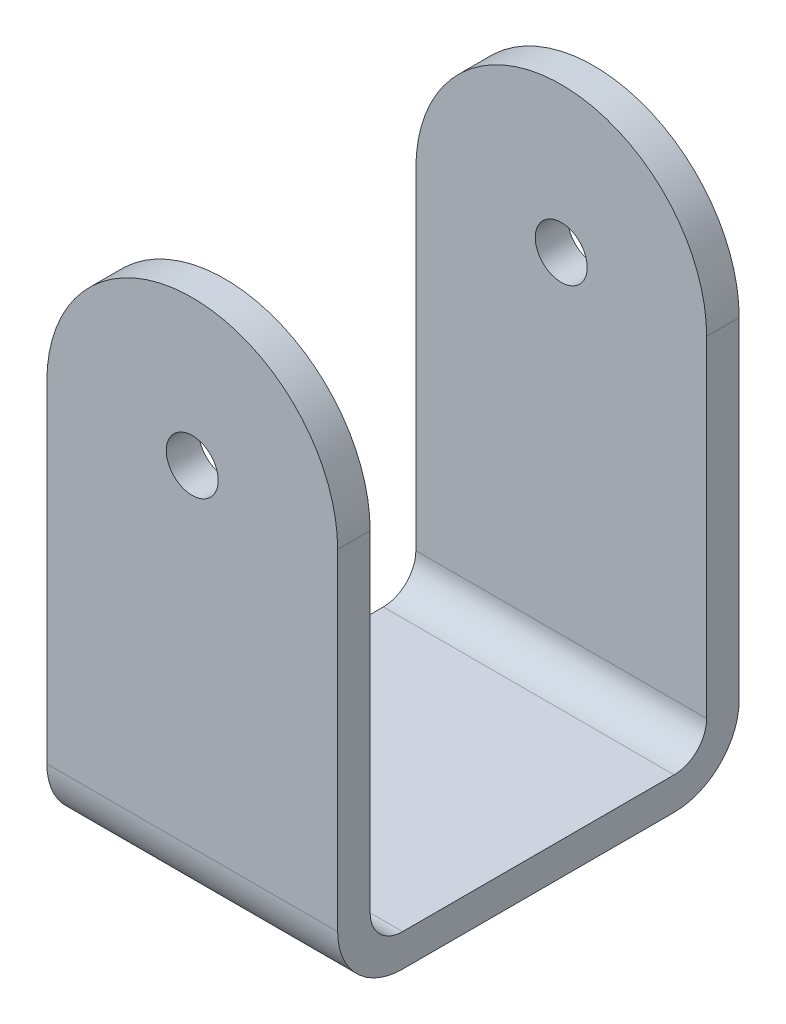
ISO-10303-21;
HEADER;
FILE_DESCRIPTION(('STEP AP214'),'2;1');
FILE_NAME('part.step','',(''),(''),'','','');
FILE_SCHEMA(('AUTOMOTIVE_DESIGN { 1 0 10303 214 1 1 1 1 }'));
ENDSEC;
DATA;
#1=APPLICATION_CONTEXT('core data for automotive mechanical design processes');
#2=APPLICATION_PROTOCOL_DEFINITION('international standard','automotive_design',2000,#1);
#3=PRODUCT_CONTEXT('',#1,'mechanical');
#4=PRODUCT('Part','Part','',(#3));
#5=PRODUCT_RELATED_PRODUCT_CATEGORY('part','',(#4));
#6=PRODUCT_DEFINITION_FORMATION('','',#4);
#7=PRODUCT_DEFINITION_CONTEXT('part definition',#1,'design');
#8=PRODUCT_DEFINITION('design','',#6,#7);
#9=PRODUCT_DEFINITION_SHAPE('','',#8);
#10=(LENGTH_UNIT() NAMED_UNIT(*) SI_UNIT(.MILLI.,.METRE.));
#11=(NAMED_UNIT(*) PLANE_ANGLE_UNIT() SI_UNIT($,.RADIAN.));
#12=(NAMED_UNIT(*) SI_UNIT($,.STERADIAN.) SOLID_ANGLE_UNIT());
#13=UNCERTAINTY_MEASURE_WITH_UNIT(LENGTH_MEASURE(1.E-05),#10,'distance_accuracy_value','');
#14=(GEOMETRIC_REPRESENTATION_CONTEXT(3) GLOBAL_UNCERTAINTY_ASSIGNED_CONTEXT((#13)) GLOBAL_UNIT_ASSIGNED_CONTEXT((#10,
#11,#12)) REPRESENTATION_CONTEXT('',''));
#15=CARTESIAN_POINT('',(0.,0.,0.));
#16=DIRECTION('',(0.,0.,1.));
#17=DIRECTION('',(1.,0.,0.));
#18=AXIS2_PLACEMENT_3D('',#15,#16,#17);
#19=CARTESIAN_POINT('',(71.12,15.875,49.0996798486636));
#20=DIRECTION('',(0.,0.,-1.));
#21=DIRECTION('',(0.,1.,0.));
#22=AXIS2_PLACEMENT_3D('',#19,#20,#21);
#23=PLANE('',#22);
#24=CARTESIAN_POINT('',(35.56,96.8502,49.0996798486636));
#25=DIRECTION('',(0.,0.,1.));
#26=DIRECTION('',(1.,0.,0.));
#27=AXIS2_PLACEMENT_3D('',#24,#25,#26);
#28=CIRCLE('',#27,6.35);
#29=CARTESIAN_POINT('',(41.91,96.8502,49.0996798486636));
#30=VERTEX_POINT('',#29);
#31=EDGE_CURVE('E278',#30,#30,#28,.T.);
#32=ORIENTED_EDGE('',*,*,#31,.F.);
#33=EDGE_LOOP('',(#32));
#34=FACE_BOUND('',#33,.T.);
#35=CARTESIAN_POINT('',(35.56,96.8502,49.0996798486636));
#36=DIRECTION('',(0.,0.,1.));
#37=DIRECTION('',(1.,0.,0.));
#38=AXIS2_PLACEMENT_3D('',#35,#36,#37);
#39=CIRCLE('',#38,35.56);
#40=CARTESIAN_POINT('',(0.,96.8502,49.0996798486636));
#41=VERTEX_POINT('',#40);
#42=CARTESIAN_POINT('',(71.12,96.8502,49.0996798486636));
#43=VERTEX_POINT('',#42);
#44=EDGE_CURVE('E82',#41,#43,#39,.F.);
#45=ORIENTED_EDGE('',*,*,#44,.F.);
#46=DIRECTION('',(0.,-1.,0.));
#47=VECTOR('',#46,1.);
#48=CARTESIAN_POINT('',(0.,15.875,49.0996798486636));
#49=LINE('',#48,#47);
#50=CARTESIAN_POINT('',(0.,15.875,49.0996798486636));
#51=VERTEX_POINT('',#50);
#52=EDGE_CURVE('E231',#41,#51,#49,.T.);
#53=ORIENTED_EDGE('',*,*,#52,.T.);
#54=DIRECTION('',(-1.,0.,0.));
#55=VECTOR('',#54,1.);
#56=CARTESIAN_POINT('',(71.12,15.875,49.0996798486636));
#57=LINE('',#56,#55);
#58=CARTESIAN_POINT('',(71.12,15.875,49.0996798486636));
#59=VERTEX_POINT('',#58);
#60=EDGE_CURVE('E208',#59,#51,#57,.T.);
#61=ORIENTED_EDGE('',*,*,#60,.F.);
#62=DIRECTION('',(0.,-1.,0.));
#63=VECTOR('',#62,1.);
#64=CARTESIAN_POINT('',(71.12,15.875,49.0996798486636));
#65=LINE('',#64,#63);
#66=EDGE_CURVE('E187',#43,#59,#65,.T.);
#67=ORIENTED_EDGE('',*,*,#66,.F.);
#68=EDGE_LOOP('',(#45,#53,#61,#67));
#69=FACE_BOUND('',#68,.T.);
#70=ADVANCED_FACE('F59',(#34,#69),#23,.F.);
#71=CARTESIAN_POINT('',(71.12,15.875,-49.0996798486636));
#72=DIRECTION('',(0.,0.,1.));
#73=DIRECTION('',(0.,-1.,0.));
#74=AXIS2_PLACEMENT_3D('',#71,#72,#73);
#75=PLANE('',#74);
#76=CARTESIAN_POINT('',(35.56,96.8502,-49.0996798486636));
#77=DIRECTION('',(0.,0.,1.));
#78=DIRECTION('',(1.,0.,0.));
#79=AXIS2_PLACEMENT_3D('',#76,#77,#78);
#80=CIRCLE('',#79,6.35);
#81=CARTESIAN_POINT('',(41.91,96.8502,-49.0996798486636));
#82=VERTEX_POINT('',#81);
#83=EDGE_CURVE('E281',#82,#82,#80,.T.);
#84=ORIENTED_EDGE('',*,*,#83,.T.);
#85=EDGE_LOOP('',(#84));
#86=FACE_BOUND('',#85,.T.);
#87=DIRECTION('',(0.,1.,0.));
#88=VECTOR('',#87,1.);
#89=CARTESIAN_POINT('',(0.,15.875,-49.0996798486636));
#90=LINE('',#89,#88);
#91=CARTESIAN_POINT('',(0.,15.875,-49.0996798486636));
#92=VERTEX_POINT('',#91);
#93=CARTESIAN_POINT('',(0.,96.8502,-49.0996798486636));
#94=VERTEX_POINT('',#93);
#95=EDGE_CURVE('E162',#92,#94,#90,.T.);
#96=ORIENTED_EDGE('',*,*,#95,.T.);
#97=CARTESIAN_POINT('',(35.56,96.8502,-49.0996798486636));
#98=DIRECTION('',(0.,0.,1.));
#99=DIRECTION('',(1.,0.,0.));
#100=AXIS2_PLACEMENT_3D('',#97,#98,#99);
#101=CIRCLE('',#100,35.56);
#102=CARTESIAN_POINT('',(71.12,96.8502,-49.0996798486636));
#103=VERTEX_POINT('',#102);
#104=EDGE_CURVE('E146',#94,#103,#101,.F.);
#105=ORIENTED_EDGE('',*,*,#104,.T.);
#106=DIRECTION('',(0.,1.,0.));
#107=VECTOR('',#106,1.);
#108=CARTESIAN_POINT('',(71.12,15.875,-49.0996798486636));
#109=LINE('',#108,#107);
#110=CARTESIAN_POINT('',(71.12,15.875,-49.0996798486636));
#111=VERTEX_POINT('',#110);
#112=EDGE_CURVE('E245',#111,#103,#109,.T.);
#113=ORIENTED_EDGE('',*,*,#112,.F.);
#114=DIRECTION('',(-1.,0.,0.));
#115=VECTOR('',#114,1.);
#116=CARTESIAN_POINT('',(71.12,15.875,-49.0996798486636));
#117=LINE('',#116,#115);
#118=EDGE_CURVE('E170',#111,#92,#117,.T.);
#119=ORIENTED_EDGE('',*,*,#118,.T.);
#120=EDGE_LOOP('',(#96,#105,#113,#119));
#121=FACE_BOUND('',#120,.T.);
#122=ADVANCED_FACE('F168',(#86,#121),#75,.F.);
#123=CARTESIAN_POINT('',(71.12,132.4102,-41.1494798486636));
#124=DIRECTION('',(0.,0.,-1.));
#125=DIRECTION('',(0.,1.,0.));
#126=AXIS2_PLACEMENT_3D('',#123,#124,#125);
#127=PLANE('',#126);
#128=CARTESIAN_POINT('',(35.56,96.8502,-41.1494798486635));
#129=DIRECTION('',(0.,0.,-1.));
#130=DIRECTION('',(0.,1.,0.));
#131=AXIS2_PLACEMENT_3D('',#128,#129,#130);
#132=CIRCLE('',#131,6.35);
#133=CARTESIAN_POINT('',(41.91,96.8502,-41.1494798486635));
#134=VERTEX_POINT('',#133);
#135=EDGE_CURVE('E165',#134,#134,#132,.T.);
#136=ORIENTED_EDGE('',*,*,#135,.T.);
#137=EDGE_LOOP('',(#136));
#138=FACE_BOUND('',#137,.T.);
#139=CARTESIAN_POINT('',(35.56,96.8502,-41.1494798486635));
#140=DIRECTION('',(0.,0.,-1.));
#141=DIRECTION('',(0.,1.,0.));
#142=AXIS2_PLACEMENT_3D('',#139,#140,#141);
#143=CIRCLE('',#142,35.56);
#144=CARTESIAN_POINT('',(71.12,96.8502,-41.1494798486635));
#145=VERTEX_POINT('',#144);
#146=CARTESIAN_POINT('',(0.,96.8502,-41.1494798486635));
#147=VERTEX_POINT('',#146);
#148=EDGE_CURVE('E74',#145,#147,#143,.F.);
#149=ORIENTED_EDGE('',*,*,#148,.T.);
#150=DIRECTION('',(0.,-1.,0.));
#151=VECTOR('',#150,1.);
#152=CARTESIAN_POINT('',(0.,132.4102,-41.1494798486636));
#153=LINE('',#152,#151);
#154=CARTESIAN_POINT('',(0.,15.9004,-41.1494798486635));
#155=VERTEX_POINT('',#154);
#156=EDGE_CURVE('E164',#147,#155,#153,.T.);
#157=ORIENTED_EDGE('',*,*,#156,.T.);
#158=DIRECTION('',(-1.,0.,0.));
#159=VECTOR('',#158,1.);
#160=CARTESIAN_POINT('',(71.12,15.9004,-41.1494798486635));
#161=LINE('',#160,#159);
#162=CARTESIAN_POINT('',(71.12,15.9004,-41.1494798486635));
#163=VERTEX_POINT('',#162);
#164=EDGE_CURVE('E198',#163,#155,#161,.T.);
#165=ORIENTED_EDGE('',*,*,#164,.F.);
#166=DIRECTION('',(0.,-1.,0.));
#167=VECTOR('',#166,1.);
#168=CARTESIAN_POINT('',(71.12,132.4102,-41.1494798486636));
#169=LINE('',#168,#167);
#170=EDGE_CURVE('E248',#145,#163,#169,.T.);
#171=ORIENTED_EDGE('',*,*,#170,.F.);
#172=EDGE_LOOP('',(#149,#157,#165,#171));
#173=FACE_BOUND('',#172,.T.);
#174=ADVANCED_FACE('F306',(#138,#173),#127,.F.);
#175=CARTESIAN_POINT('',(71.12,132.4102,41.1494798486636));
#176=DIRECTION('',(0.,0.,1.));
#177=DIRECTION('',(0.,-1.,0.));
#178=AXIS2_PLACEMENT_3D('',#175,#176,#177);
#179=PLANE('',#178);
#180=CARTESIAN_POINT('',(35.56,96.8502,41.1494798486636));
#181=DIRECTION('',(0.,0.,1.));
#182=DIRECTION('',(0.,-1.,0.));
#183=AXIS2_PLACEMENT_3D('',#180,#181,#182);
#184=CIRCLE('',#183,6.35);
#185=CARTESIAN_POINT('',(41.91,96.8502,41.1494798486636));
#186=VERTEX_POINT('',#185);
#187=EDGE_CURVE('E62',#186,#186,#184,.T.);
#188=ORIENTED_EDGE('',*,*,#187,.T.);
#189=EDGE_LOOP('',(#188));
#190=FACE_BOUND('',#189,.T.);
#191=DIRECTION('',(0.,1.,0.));
#192=VECTOR('',#191,1.);
#193=CARTESIAN_POINT('',(0.,132.4102,41.1494798486636));
#194=LINE('',#193,#192);
#195=CARTESIAN_POINT('',(0.,15.9004,41.1494798486635));
#196=VERTEX_POINT('',#195);
#197=CARTESIAN_POINT('',(0.,96.8502,41.1494798486635));
#198=VERTEX_POINT('',#197);
#199=EDGE_CURVE('E184',#196,#198,#194,.T.);
#200=ORIENTED_EDGE('',*,*,#199,.T.);
#201=CARTESIAN_POINT('',(35.56,96.8502,41.1494798486636));
#202=DIRECTION('',(0.,0.,1.));
#203=DIRECTION('',(0.,-1.,0.));
#204=AXIS2_PLACEMENT_3D('',#201,#202,#203);
#205=CIRCLE('',#204,35.56);
#206=CARTESIAN_POINT('',(71.12,96.8502,41.1494798486635));
#207=VERTEX_POINT('',#206);
#208=EDGE_CURVE('E213',#198,#207,#205,.F.);
#209=ORIENTED_EDGE('',*,*,#208,.T.);
#210=DIRECTION('',(0.,1.,0.));
#211=VECTOR('',#210,1.);
#212=CARTESIAN_POINT('',(71.12,132.4102,41.1494798486636));
#213=LINE('',#212,#211);
#214=CARTESIAN_POINT('',(71.12,15.9004,41.1494798486635));
#215=VERTEX_POINT('',#214);
#216=EDGE_CURVE('E192',#215,#207,#213,.T.);
#217=ORIENTED_EDGE('',*,*,#216,.F.);
#218=DIRECTION('',(-1.,0.,0.));
#219=VECTOR('',#218,1.);
#220=CARTESIAN_POINT('',(71.12,15.9004,41.1494798486635));
#221=LINE('',#220,#219);
#222=EDGE_CURVE('E188',#215,#196,#221,.T.);
#223=ORIENTED_EDGE('',*,*,#222,.T.);
#224=EDGE_LOOP('',(#200,#209,#217,#223));
#225=FACE_BOUND('',#224,.T.);
#226=ADVANCED_FACE('F219',(#190,#225),#179,.F.);
#227=CARTESIAN_POINT('',(71.12,15.875,33.2246798486636));
#228=DIRECTION('',(-1.,0.,0.));
#229=DIRECTION('',(0.,0.,1.));
#230=AXIS2_PLACEMENT_3D('',#227,#228,#229);
#231=CYLINDRICAL_SURFACE('',#230,15.875);
#232=CARTESIAN_POINT('',(0.,15.875,33.2246798486636));
#233=DIRECTION('',(1.,0.,0.));
#234=DIRECTION('',(0.,0.,1.));
#235=AXIS2_PLACEMENT_3D('',#232,#233,#234);
#236=CIRCLE('',#235,15.875);
#237=CARTESIAN_POINT('',(0.,0.,33.2246798486636));
#238=VERTEX_POINT('',#237);
#239=EDGE_CURVE('E233',#51,#238,#236,.T.);
#240=ORIENTED_EDGE('',*,*,#239,.T.);
#241=DIRECTION('',(-1.,0.,0.));
#242=VECTOR('',#241,1.);
#243=CARTESIAN_POINT('',(71.12,0.,33.2246798486636));
#244=LINE('',#243,#242);
#245=CARTESIAN_POINT('',(71.12,0.,33.2246798486636));
#246=VERTEX_POINT('',#245);
#247=EDGE_CURVE('E205',#246,#238,#244,.T.);
#248=ORIENTED_EDGE('',*,*,#247,.F.);
#249=CARTESIAN_POINT('',(71.12,15.875,33.2246798486636));
#250=DIRECTION('',(1.,0.,0.));
#251=DIRECTION('',(0.,0.,1.));
#252=AXIS2_PLACEMENT_3D('',#249,#250,#251);
#253=CIRCLE('',#252,15.875);
#254=EDGE_CURVE('E250',#59,#246,#253,.T.);
#255=ORIENTED_EDGE('',*,*,#254,.F.);
#256=ORIENTED_EDGE('',*,*,#60,.T.);
#257=EDGE_LOOP('',(#240,#248,#255,#256));
#258=FACE_BOUND('',#257,.T.);
#259=ADVANCED_FACE('F270',(#258),#231,.T.);
#260=CARTESIAN_POINT('',(71.12,0.,-33.2246798486636));
#261=DIRECTION('',(0.,1.,0.));
#262=DIRECTION('',(0.,0.,1.));
#263=AXIS2_PLACEMENT_3D('',#260,#261,#262);
#264=PLANE('',#263);
#265=DIRECTION('',(0.,0.,-1.));
#266=VECTOR('',#265,1.);
#267=CARTESIAN_POINT('',(0.,0.,-33.2246798486636));
#268=LINE('',#267,#266);
#269=CARTESIAN_POINT('',(0.,0.,-33.2246798486636));
#270=VERTEX_POINT('',#269);
#271=EDGE_CURVE('E175',#238,#270,#268,.T.);
#272=ORIENTED_EDGE('',*,*,#271,.T.);
#273=DIRECTION('',(-1.,0.,0.));
#274=VECTOR('',#273,1.);
#275=CARTESIAN_POINT('',(71.12,0.,-33.2246798486636));
#276=LINE('',#275,#274);
#277=CARTESIAN_POINT('',(71.12,0.,-33.2246798486636));
#278=VERTEX_POINT('',#277);
#279=EDGE_CURVE('E202',#278,#270,#276,.T.);
#280=ORIENTED_EDGE('',*,*,#279,.F.);
#281=DIRECTION('',(0.,0.,-1.));
#282=VECTOR('',#281,1.);
#283=CARTESIAN_POINT('',(71.12,0.,-33.2246798486636));
#284=LINE('',#283,#282);
#285=EDGE_CURVE('E246',#246,#278,#284,.T.);
#286=ORIENTED_EDGE('',*,*,#285,.F.);
#287=ORIENTED_EDGE('',*,*,#247,.T.);
#288=EDGE_LOOP('',(#272,#280,#286,#287));
#289=FACE_BOUND('',#288,.T.);
#290=ADVANCED_FACE('F237',(#289),#264,.F.);
#291=CARTESIAN_POINT('',(71.12,15.875,-33.2246798486636));
#292=DIRECTION('',(-1.,0.,0.));
#293=DIRECTION('',(0.,0.,1.));
#294=AXIS2_PLACEMENT_3D('',#291,#292,#293);
#295=CYLINDRICAL_SURFACE('',#294,15.875);
#296=CARTESIAN_POINT('',(0.,15.875,-33.2246798486636));
#297=DIRECTION('',(1.,0.,0.));
#298=DIRECTION('',(0.,0.,-1.));
#299=AXIS2_PLACEMENT_3D('',#296,#297,#298);
#300=CIRCLE('',#299,15.875);
#301=EDGE_CURVE('E171',#270,#92,#300,.T.);
#302=ORIENTED_EDGE('',*,*,#301,.T.);
#303=ORIENTED_EDGE('',*,*,#118,.F.);
#304=CARTESIAN_POINT('',(71.12,15.875,-33.2246798486636));
#305=DIRECTION('',(1.,0.,0.));
#306=DIRECTION('',(0.,0.,-1.));
#307=AXIS2_PLACEMENT_3D('',#304,#305,#306);
#308=CIRCLE('',#307,15.875);
#309=EDGE_CURVE('E244',#278,#111,#308,.T.);
#310=ORIENTED_EDGE('',*,*,#309,.F.);
#311=ORIENTED_EDGE('',*,*,#279,.T.);
#312=EDGE_LOOP('',(#302,#303,#310,#311));
#313=FACE_BOUND('',#312,.T.);
#314=ADVANCED_FACE('F243',(#313),#295,.T.);
#315=CARTESIAN_POINT('',(71.12,15.9004,-33.1992798486635));
#316=DIRECTION('',(-1.,0.,0.));
#317=DIRECTION('',(0.,0.,1.));
#318=AXIS2_PLACEMENT_3D('',#315,#316,#317);
#319=CYLINDRICAL_SURFACE('',#318,7.9502);
#320=CARTESIAN_POINT('',(0.,15.9004,-33.1992798486635));
#321=DIRECTION('',(-1.,0.,0.));
#322=DIRECTION('',(0.,0.,1.));
#323=AXIS2_PLACEMENT_3D('',#320,#321,#322);
#324=CIRCLE('',#323,7.9502);
#325=CARTESIAN_POINT('',(0.,7.9502,-33.1992798486635));
#326=VERTEX_POINT('',#325);
#327=EDGE_CURVE('E173',#155,#326,#324,.T.);
#328=ORIENTED_EDGE('',*,*,#327,.T.);
#329=DIRECTION('',(-1.,0.,0.));
#330=VECTOR('',#329,1.);
#331=CARTESIAN_POINT('',(71.12,7.9502,-33.1992798486635));
#332=LINE('',#331,#330);
#333=CARTESIAN_POINT('',(71.12,7.9502,-33.1992798486635));
#334=VERTEX_POINT('',#333);
#335=EDGE_CURVE('E195',#334,#326,#332,.T.);
#336=ORIENTED_EDGE('',*,*,#335,.F.);
#337=CARTESIAN_POINT('',(71.12,15.9004,-33.1992798486635));
#338=DIRECTION('',(-1.,0.,0.));
#339=DIRECTION('',(0.,0.,1.));
#340=AXIS2_PLACEMENT_3D('',#337,#338,#339);
#341=CIRCLE('',#340,7.9502);
#342=EDGE_CURVE('E255',#163,#334,#341,.T.);
#343=ORIENTED_EDGE('',*,*,#342,.F.);
#344=ORIENTED_EDGE('',*,*,#164,.T.);
#345=EDGE_LOOP('',(#328,#336,#343,#344));
#346=FACE_BOUND('',#345,.T.);
#347=ADVANCED_FACE('F318',(#346),#319,.F.);
#348=CARTESIAN_POINT('',(71.12,7.9502,33.1992798486635));
#349=DIRECTION('',(0.,-1.,0.));
#350=DIRECTION('',(0.,0.,-1.));
#351=AXIS2_PLACEMENT_3D('',#348,#349,#350);
#352=PLANE('',#351);
#353=DIRECTION('',(0.,0.,1.));
#354=VECTOR('',#353,1.);
#355=CARTESIAN_POINT('',(0.,7.9502,33.1992798486635));
#356=LINE('',#355,#354);
#357=CARTESIAN_POINT('',(0.,7.9502,33.1992798486635));
#358=VERTEX_POINT('',#357);
#359=EDGE_CURVE('E180',#326,#358,#356,.T.);
#360=ORIENTED_EDGE('',*,*,#359,.T.);
#361=DIRECTION('',(-1.,0.,0.));
#362=VECTOR('',#361,1.);
#363=CARTESIAN_POINT('',(71.12,7.9502,33.1992798486635));
#364=LINE('',#363,#362);
#365=CARTESIAN_POINT('',(71.12,7.9502,33.1992798486635));
#366=VERTEX_POINT('',#365);
#367=EDGE_CURVE('E191',#366,#358,#364,.T.);
#368=ORIENTED_EDGE('',*,*,#367,.F.);
#369=DIRECTION('',(0.,0.,1.));
#370=VECTOR('',#369,1.);
#371=CARTESIAN_POINT('',(71.12,7.9502,33.1992798486635));
#372=LINE('',#371,#370);
#373=EDGE_CURVE('E227',#334,#366,#372,.T.);
#374=ORIENTED_EDGE('',*,*,#373,.F.);
#375=ORIENTED_EDGE('',*,*,#335,.T.);
#376=EDGE_LOOP('',(#360,#368,#374,#375));
#377=FACE_BOUND('',#376,.T.);
#378=ADVANCED_FACE('F261',(#377),#352,.F.);
#379=CARTESIAN_POINT('',(71.12,15.9004,33.1992798486635));
#380=DIRECTION('',(-1.,0.,0.));
#381=DIRECTION('',(0.,0.,1.));
#382=AXIS2_PLACEMENT_3D('',#379,#380,#381);
#383=CYLINDRICAL_SURFACE('',#382,7.9502);
#384=CARTESIAN_POINT('',(0.,15.9004,33.1992798486635));
#385=DIRECTION('',(-1.,0.,0.));
#386=DIRECTION('',(0.,0.,-1.));
#387=AXIS2_PLACEMENT_3D('',#384,#385,#386);
#388=CIRCLE('',#387,7.9502);
#389=EDGE_CURVE('E182',#358,#196,#388,.T.);
#390=ORIENTED_EDGE('',*,*,#389,.T.);
#391=ORIENTED_EDGE('',*,*,#222,.F.);
#392=CARTESIAN_POINT('',(71.12,15.9004,33.1992798486635));
#393=DIRECTION('',(-1.,0.,0.));
#394=DIRECTION('',(0.,0.,-1.));
#395=AXIS2_PLACEMENT_3D('',#392,#393,#394);
#396=CIRCLE('',#395,7.9502);
#397=EDGE_CURVE('E224',#366,#215,#396,.T.);
#398=ORIENTED_EDGE('',*,*,#397,.F.);
#399=ORIENTED_EDGE('',*,*,#367,.T.);
#400=EDGE_LOOP('',(#390,#391,#398,#399));
#401=FACE_BOUND('',#400,.T.);
#402=ADVANCED_FACE('F265',(#401),#383,.F.);
#403=CARTESIAN_POINT('',(71.12,15.9004,33.1992798486635));
#404=DIRECTION('',(1.,0.,0.));
#405=DIRECTION('',(0.,0.,-1.));
#406=AXIS2_PLACEMENT_3D('',#403,#404,#405);
#407=PLANE('',#406);
#408=DIRECTION('',(0.,0.,1.));
#409=VECTOR('',#408,1.);
#410=CARTESIAN_POINT('',(71.12,96.8502,-49.0996798486636));
#411=LINE('',#410,#409);
#412=EDGE_CURVE('E67',#43,#207,#411,.F.);
#413=ORIENTED_EDGE('',*,*,#412,.F.);
#414=ORIENTED_EDGE('',*,*,#66,.T.);
#415=ORIENTED_EDGE('',*,*,#254,.T.);
#416=ORIENTED_EDGE('',*,*,#285,.T.);
#417=ORIENTED_EDGE('',*,*,#309,.T.);
#418=ORIENTED_EDGE('',*,*,#112,.T.);
#419=DIRECTION('',(0.,0.,1.));
#420=VECTOR('',#419,1.);
#421=CARTESIAN_POINT('',(71.12,96.8502,-49.0996798486636));
#422=LINE('',#421,#420);
#423=EDGE_CURVE('E151',#103,#145,#422,.T.);
#424=ORIENTED_EDGE('',*,*,#423,.T.);
#425=ORIENTED_EDGE('',*,*,#170,.T.);
#426=ORIENTED_EDGE('',*,*,#342,.T.);
#427=ORIENTED_EDGE('',*,*,#373,.T.);
#428=ORIENTED_EDGE('',*,*,#397,.T.);
#429=ORIENTED_EDGE('',*,*,#216,.T.);
#430=EDGE_LOOP('',(#413,#414,#415,#416,#417,#418,#424,#425,#426,#427,#428,#429));
#431=FACE_BOUND('',#430,.T.);
#432=ADVANCED_FACE('F222',(#431),#407,.T.);
#433=CARTESIAN_POINT('',(0.,15.9004,33.1992798486635));
#434=DIRECTION('',(1.,0.,0.));
#435=DIRECTION('',(0.,0.,-1.));
#436=AXIS2_PLACEMENT_3D('',#433,#434,#435);
#437=PLANE('',#436);
#438=ORIENTED_EDGE('',*,*,#52,.F.);
#439=DIRECTION('',(0.,0.,1.));
#440=VECTOR('',#439,1.);
#441=CARTESIAN_POINT('',(0.,96.8502,-49.0996798486636));
#442=LINE('',#441,#440);
#443=EDGE_CURVE('E12',#41,#198,#442,.F.);
#444=ORIENTED_EDGE('',*,*,#443,.T.);
#445=ORIENTED_EDGE('',*,*,#199,.F.);
#446=ORIENTED_EDGE('',*,*,#389,.F.);
#447=ORIENTED_EDGE('',*,*,#359,.F.);
#448=ORIENTED_EDGE('',*,*,#327,.F.);
#449=ORIENTED_EDGE('',*,*,#156,.F.);
#450=DIRECTION('',(0.,0.,1.));
#451=VECTOR('',#450,1.);
#452=CARTESIAN_POINT('',(0.,96.8502,-49.0996798486636));
#453=LINE('',#452,#451);
#454=EDGE_CURVE('E149',#94,#147,#453,.T.);
#455=ORIENTED_EDGE('',*,*,#454,.F.);
#456=ORIENTED_EDGE('',*,*,#95,.F.);
#457=ORIENTED_EDGE('',*,*,#301,.F.);
#458=ORIENTED_EDGE('',*,*,#271,.F.);
#459=ORIENTED_EDGE('',*,*,#239,.F.);
#460=EDGE_LOOP('',(#438,#444,#445,#446,#447,#448,#449,#455,#456,#457,#458,#459));
#461=FACE_BOUND('',#460,.T.);
#462=ADVANCED_FACE('F160',(#461),#437,.F.);
#463=CARTESIAN_POINT('',(35.56,96.8502,-49.0996798486636));
#464=DIRECTION('',(0.,0.,1.));
#465=DIRECTION('',(1.,0.,0.));
#466=AXIS2_PLACEMENT_3D('',#463,#464,#465);
#467=CYLINDRICAL_SURFACE('',#466,35.56);
#468=ORIENTED_EDGE('',*,*,#423,.F.);
#469=ORIENTED_EDGE('',*,*,#104,.F.);
#470=ORIENTED_EDGE('',*,*,#454,.T.);
#471=ORIENTED_EDGE('',*,*,#148,.F.);
#472=EDGE_LOOP('',(#468,#469,#470,#471));
#473=FACE_BOUND('',#472,.T.);
#474=ADVANCED_FACE('F148',(#473),#467,.T.);
#475=ORIENTED_EDGE('',*,*,#208,.F.);
#476=ORIENTED_EDGE('',*,*,#443,.F.);
#477=ORIENTED_EDGE('',*,*,#44,.T.);
#478=ORIENTED_EDGE('',*,*,#412,.T.);
#479=EDGE_LOOP('',(#475,#476,#477,#478));
#480=FACE_BOUND('',#479,.T.);
#481=ADVANCED_FACE('F212',(#480),#467,.T.);
#482=CARTESIAN_POINT('',(35.56,96.8502,-49.0996798486636));
#483=DIRECTION('',(0.,0.,1.));
#484=DIRECTION('',(1.,0.,0.));
#485=AXIS2_PLACEMENT_3D('',#482,#483,#484);
#486=CYLINDRICAL_SURFACE('',#485,6.35);
#487=CARTESIAN_POINT('',(41.91,96.8502,49.0996798486636));
#488=CARTESIAN_POINT('',(41.91,96.8502,49.0168652653303));
#489=CARTESIAN_POINT('',(41.91,96.8502,48.9340506819969));
#490=CARTESIAN_POINT('',(41.91,96.8502,48.7684215153303));
#491=CARTESIAN_POINT('',(41.91,96.8502,48.6856069319969));
#492=CARTESIAN_POINT('',(41.91,96.8502,48.5199777653302));
#493=CARTESIAN_POINT('',(41.91,96.8502,48.4371631819969));
#494=CARTESIAN_POINT('',(41.91,96.8502,48.2715340153302));
#495=CARTESIAN_POINT('',(41.91,96.8502,48.1887194319969));
#496=CARTESIAN_POINT('',(41.91,96.8502,48.0230902653302));
#497=CARTESIAN_POINT('',(41.91,96.8502,47.9402756819969));
#498=CARTESIAN_POINT('',(41.91,96.8502,47.7746465153303));
#499=CARTESIAN_POINT('',(41.91,96.8502,47.6918319319969));
#500=CARTESIAN_POINT('',(41.91,96.8502,47.5262027653302));
#501=CARTESIAN_POINT('',(41.91,96.8502,47.4433881819969));
#502=CARTESIAN_POINT('',(41.91,96.8502,47.2777590153302));
#503=CARTESIAN_POINT('',(41.91,96.8502,47.1949444319969));
#504=CARTESIAN_POINT('',(41.91,96.8502,47.0293152653302));
#505=CARTESIAN_POINT('',(41.91,96.8502,46.9465006819969));
#506=CARTESIAN_POINT('',(41.91,96.8502,46.7808715153303));
#507=CARTESIAN_POINT('',(41.91,96.8502,46.6980569319969));
#508=CARTESIAN_POINT('',(41.91,96.8502,46.5324277653302));
#509=CARTESIAN_POINT('',(41.91,96.8502,46.4496131819969));
#510=CARTESIAN_POINT('',(41.91,96.8502,46.2839840153302));
#511=CARTESIAN_POINT('',(41.91,96.8502,46.2011694319969));
#512=CARTESIAN_POINT('',(41.91,96.8502,46.0355402653302));
#513=CARTESIAN_POINT('',(41.91,96.8502,45.9527256819969));
#514=CARTESIAN_POINT('',(41.91,96.8502,45.7870965153302));
#515=CARTESIAN_POINT('',(41.91,96.8502,45.7042819319969));
#516=CARTESIAN_POINT('',(41.91,96.8502,45.5386527653302));
#517=CARTESIAN_POINT('',(41.91,96.8502,45.4558381819969));
#518=CARTESIAN_POINT('',(41.91,96.8502,45.2902090153302));
#519=CARTESIAN_POINT('',(41.91,96.8502,45.2073944319969));
#520=CARTESIAN_POINT('',(41.91,96.8502,45.0417652653302));
#521=CARTESIAN_POINT('',(41.91,96.8502,44.9589506819969));
#522=CARTESIAN_POINT('',(41.91,96.8502,44.7933215153302));
#523=CARTESIAN_POINT('',(41.91,96.8502,44.7105069319969));
#524=CARTESIAN_POINT('',(41.91,96.8502,44.5448777653302));
#525=CARTESIAN_POINT('',(41.91,96.8502,44.4620631819969));
#526=CARTESIAN_POINT('',(41.91,96.8502,44.2964340153302));
#527=CARTESIAN_POINT('',(41.91,96.8502,44.2136194319969));
#528=CARTESIAN_POINT('',(41.91,96.8502,44.0479902653302));
#529=CARTESIAN_POINT('',(41.91,96.8502,43.9651756819969));
#530=CARTESIAN_POINT('',(41.91,96.8502,43.7995465153302));
#531=CARTESIAN_POINT('',(41.91,96.8502,43.7167319319969));
#532=CARTESIAN_POINT('',(41.91,96.8502,43.5511027653302));
#533=CARTESIAN_POINT('',(41.91,96.8502,43.4682881819969));
#534=CARTESIAN_POINT('',(41.91,96.8502,43.3026590153302));
#535=CARTESIAN_POINT('',(41.91,96.8502,43.2198444319969));
#536=CARTESIAN_POINT('',(41.91,96.8502,43.0542152653302));
#537=CARTESIAN_POINT('',(41.91,96.8502,42.9714006819969));
#538=CARTESIAN_POINT('',(41.91,96.8502,42.8057715153302));
#539=CARTESIAN_POINT('',(41.91,96.8502,42.7229569319969));
#540=CARTESIAN_POINT('',(41.91,96.8502,42.5573277653302));
#541=CARTESIAN_POINT('',(41.91,96.8502,42.4745131819969));
#542=CARTESIAN_POINT('',(41.91,96.8502,42.3088840153302));
#543=CARTESIAN_POINT('',(41.91,96.8502,42.2260694319969));
#544=CARTESIAN_POINT('',(41.91,96.8502,42.0604402653302));
#545=CARTESIAN_POINT('',(41.91,96.8502,41.9776256819969));
#546=CARTESIAN_POINT('',(41.91,96.8502,41.8119965153302));
#547=CARTESIAN_POINT('',(41.91,96.8502,41.7291819319969));
#548=CARTESIAN_POINT('',(41.91,96.8502,41.5635527653302));
#549=CARTESIAN_POINT('',(41.91,96.8502,41.4807381819969));
#550=CARTESIAN_POINT('',(41.91,96.8502,41.3151090153302));
#551=CARTESIAN_POINT('',(41.91,96.8502,41.2322944319969));
#552=CARTESIAN_POINT('',(41.91,96.8502,41.1494798486636));
#553=B_SPLINE_CURVE_WITH_KNOTS('',3,(#487,#488,#489,#490,#491,#492,#493,#494,#495,#496,#497,
#498,#499,#500,#501,#502,#503,#504,#505,#506,#507,#508,#509,#510,#511,#512,#513,#514,#515,#516,
#517,#518,#519,#520,#521,#522,#523,#524,#525,#526,#527,#528,#529,#530,#531,#532,#533,#534,#535,
#536,#537,#538,#539,#540,#541,#542,#543,#544,#545,#546,#547,#548,#549,#550,#551,#552),
.UNSPECIFIED.,.F.,.F.,(4,2,2,2,2,2,2,2,2,2,2,2,2,2,2,2,2,2,2,2,2,2,2,2,2,2,2,2,2,2,2,2,4),(0.,
0.248443749999994,0.496887500000001,0.745331250000009,0.993775000000002,1.24221875,1.4906625,
1.73910625000001,1.98755,2.23599375,2.48443750000001,2.73288125000001,2.98132500000001,
3.22976875,3.47821250000001,3.72665625000002,3.97510000000001,4.22354375,4.47198750000001,
4.72043125000002,4.96887500000001,5.21731875,5.46576250000001,5.71420625000002,5.96265000000001,
6.21109375000001,6.45953750000001,6.70798125000002,6.95642500000002,7.20486875000001,
7.45331250000002,7.70175625000002,7.95020000000002),.UNSPECIFIED.);
#554=EDGE_CURVE('BSEAM289',#30,#186,#553,.T.);
#555=ORIENTED_EDGE('',*,*,#31,.T.);
#556=ORIENTED_EDGE('',*,*,#187,.F.);
#557=ORIENTED_EDGE('',*,*,#554,.T.);
#558=ORIENTED_EDGE('',*,*,#554,.F.);
#559=EDGE_LOOP('',(#555,#557,#556,#558));
#560=FACE_BOUND('',#559,.T.);
#561=ADVANCED_FACE('F289',(#560),#486,.F.);
#562=CARTESIAN_POINT('',(41.91,96.8502,-49.0996798486636));
#563=CARTESIAN_POINT('',(41.91,96.8502,-49.0168652653303));
#564=CARTESIAN_POINT('',(41.91,96.8502,-48.9340506819969));
#565=CARTESIAN_POINT('',(41.91,96.8502,-48.7684215153303));
#566=CARTESIAN_POINT('',(41.91,96.8502,-48.6856069319969));
#567=CARTESIAN_POINT('',(41.91,96.8502,-48.5199777653302));
#568=CARTESIAN_POINT('',(41.91,96.8502,-48.4371631819969));
#569=CARTESIAN_POINT('',(41.91,96.8502,-48.2715340153302));
#570=CARTESIAN_POINT('',(41.91,96.8502,-48.1887194319969));
#571=CARTESIAN_POINT('',(41.91,96.8502,-48.0230902653302));
#572=CARTESIAN_POINT('',(41.91,96.8502,-47.9402756819969));
#573=CARTESIAN_POINT('',(41.91,96.8502,-47.7746465153302));
#574=CARTESIAN_POINT('',(41.91,96.8502,-47.6918319319969));
#575=CARTESIAN_POINT('',(41.91,96.8502,-47.5262027653302));
#576=CARTESIAN_POINT('',(41.91,96.8502,-47.4433881819969));
#577=CARTESIAN_POINT('',(41.91,96.8502,-47.2777590153302));
#578=CARTESIAN_POINT('',(41.91,96.8502,-47.1949444319969));
#579=CARTESIAN_POINT('',(41.91,96.8502,-47.0293152653302));
#580=CARTESIAN_POINT('',(41.91,96.8502,-46.9465006819969));
#581=CARTESIAN_POINT('',(41.91,96.8502,-46.7808715153302));
#582=CARTESIAN_POINT('',(41.91,96.8502,-46.6980569319969));
#583=CARTESIAN_POINT('',(41.91,96.8502,-46.5324277653302));
#584=CARTESIAN_POINT('',(41.91,96.8502,-46.4496131819969));
#585=CARTESIAN_POINT('',(41.91,96.8502,-46.2839840153302));
#586=CARTESIAN_POINT('',(41.91,96.8502,-46.2011694319969));
#587=CARTESIAN_POINT('',(41.91,96.8502,-46.0355402653302));
#588=CARTESIAN_POINT('',(41.91,96.8502,-45.9527256819969));
#589=CARTESIAN_POINT('',(41.91,96.8502,-45.7870965153302));
#590=CARTESIAN_POINT('',(41.91,96.8502,-45.7042819319969));
#591=CARTESIAN_POINT('',(41.91,96.8502,-45.5386527653302));
#592=CARTESIAN_POINT('',(41.91,96.8502,-45.4558381819969));
#593=CARTESIAN_POINT('',(41.91,96.8502,-45.2902090153302));
#594=CARTESIAN_POINT('',(41.91,96.8502,-45.2073944319969));
#595=CARTESIAN_POINT('',(41.91,96.8502,-45.0417652653302));
#596=CARTESIAN_POINT('',(41.91,96.8502,-44.9589506819969));
#597=CARTESIAN_POINT('',(41.91,96.8502,-44.7933215153302));
#598=CARTESIAN_POINT('',(41.91,96.8502,-44.7105069319969));
#599=CARTESIAN_POINT('',(41.91,96.8502,-44.5448777653302));
#600=CARTESIAN_POINT('',(41.91,96.8502,-44.4620631819969));
#601=CARTESIAN_POINT('',(41.91,96.8502,-44.2964340153302));
#602=CARTESIAN_POINT('',(41.91,96.8502,-44.2136194319969));
#603=CARTESIAN_POINT('',(41.91,96.8502,-44.0479902653302));
#604=CARTESIAN_POINT('',(41.91,96.8502,-43.9651756819969));
#605=CARTESIAN_POINT('',(41.91,96.8502,-43.7995465153302));
#606=CARTESIAN_POINT('',(41.91,96.8502,-43.7167319319969));
#607=CARTESIAN_POINT('',(41.91,96.8502,-43.5511027653302));
#608=CARTESIAN_POINT('',(41.91,96.8502,-43.4682881819969));
#609=CARTESIAN_POINT('',(41.91,96.8502,-43.3026590153302));
#610=CARTESIAN_POINT('',(41.91,96.8502,-43.2198444319969));
#611=CARTESIAN_POINT('',(41.91,96.8502,-43.0542152653302));
#612=CARTESIAN_POINT('',(41.91,96.8502,-42.9714006819969));
#613=CARTESIAN_POINT('',(41.91,96.8502,-42.8057715153302));
#614=CARTESIAN_POINT('',(41.91,96.8502,-42.7229569319969));
#615=CARTESIAN_POINT('',(41.91,96.8502,-42.5573277653302));
#616=CARTESIAN_POINT('',(41.91,96.8502,-42.4745131819969));
#617=CARTESIAN_POINT('',(41.91,96.8502,-42.3088840153302));
#618=CARTESIAN_POINT('',(41.91,96.8502,-42.2260694319969));
#619=CARTESIAN_POINT('',(41.91,96.8502,-42.0604402653302));
#620=CARTESIAN_POINT('',(41.91,96.8502,-41.9776256819969));
#621=CARTESIAN_POINT('',(41.91,96.8502,-41.8119965153302));
#622=CARTESIAN_POINT('',(41.91,96.8502,-41.7291819319969));
#623=CARTESIAN_POINT('',(41.91,96.8502,-41.5635527653302));
#624=CARTESIAN_POINT('',(41.91,96.8502,-41.4807381819969));
#625=CARTESIAN_POINT('',(41.91,96.8502,-41.3151090153302));
#626=CARTESIAN_POINT('',(41.91,96.8502,-41.2322944319969));
#627=CARTESIAN_POINT('',(41.91,96.8502,-41.1494798486635));
#628=B_SPLINE_CURVE_WITH_KNOTS('',3,(#562,#563,#564,#565,#566,#567,#568,#569,#570,#571,#572,
#573,#574,#575,#576,#577,#578,#579,#580,#581,#582,#583,#584,#585,#586,#587,#588,#589,#590,#591,
#592,#593,#594,#595,#596,#597,#598,#599,#600,#601,#602,#603,#604,#605,#606,#607,#608,#609,#610,
#611,#612,#613,#614,#615,#616,#617,#618,#619,#620,#621,#622,#623,#624,#625,#626,#627),
.UNSPECIFIED.,.F.,.F.,(4,2,2,2,2,2,2,2,2,2,2,2,2,2,2,2,2,2,2,2,2,2,2,2,2,2,2,2,2,2,2,2,4),(0.,
0.248443750000001,0.496887500000001,0.745331250000002,0.993775000000002,1.24221875,1.4906625,
1.73910625,1.98755000000001,2.23599375000001,2.48443750000001,2.73288125000001,2.98132500000001,
3.22976875000001,3.47821250000001,3.72665625000002,3.97510000000002,4.22354375000002,
4.47198750000002,4.72043125000002,4.96887500000003,5.21731875000003,5.46576250000003,
5.71420625000003,5.96265000000003,6.21109375000004,6.45953750000004,6.70798125000004,
6.95642500000004,7.20486875000004,7.45331250000005,7.70175625000005,7.95020000000005),.UNSPECIFIED.);
#629=EDGE_CURVE('BSEAM291',#82,#134,#628,.T.);
#630=ORIENTED_EDGE('',*,*,#83,.F.);
#631=ORIENTED_EDGE('',*,*,#135,.F.);
#632=ORIENTED_EDGE('',*,*,#629,.T.);
#633=ORIENTED_EDGE('',*,*,#629,.F.);
#634=EDGE_LOOP('',(#630,#632,#631,#633));
#635=FACE_BOUND('',#634,.T.);
#636=ADVANCED_FACE('F291',(#635),#486,.F.);
#637=CLOSED_SHELL('',(#70,#122,#174,#226,#259,#290,#314,#347,#378,#402,#432,#462,#474,#481,#561,#636));
#638=MANIFOLD_SOLID_BREP('B2',#637);
#639=ADVANCED_BREP_SHAPE_REPRESENTATION('',(#18,#638),#14);
#640=SHAPE_DEFINITION_REPRESENTATION(#9,#639);
ENDSEC;
END-ISO-10303-21;
